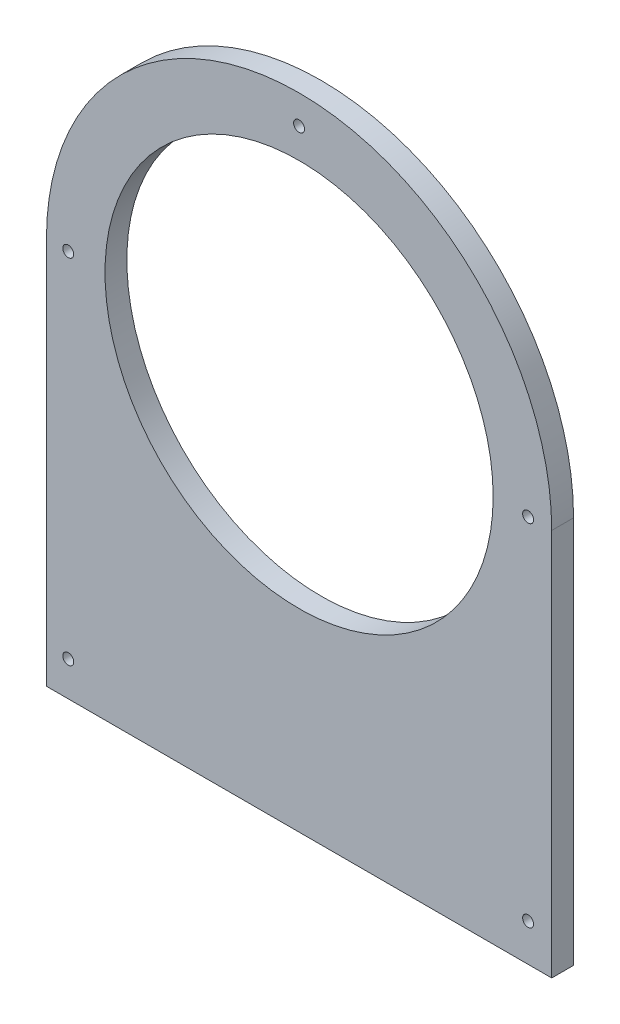
ISO-10303-21;
HEADER;
FILE_DESCRIPTION(('STEP AP214'),'2;1');
FILE_NAME('part.step','',(''),(''),'','','');
FILE_SCHEMA(('AUTOMOTIVE_DESIGN { 1 0 10303 214 1 1 1 1 }'));
ENDSEC;
DATA;
#1=APPLICATION_CONTEXT('core data for automotive mechanical design processes');
#2=APPLICATION_PROTOCOL_DEFINITION('international standard','automotive_design',2000,#1);
#3=PRODUCT_CONTEXT('',#1,'mechanical');
#4=PRODUCT('Part','Part','',(#3));
#5=PRODUCT_RELATED_PRODUCT_CATEGORY('part','',(#4));
#6=PRODUCT_DEFINITION_FORMATION('','',#4);
#7=PRODUCT_DEFINITION_CONTEXT('part definition',#1,'design');
#8=PRODUCT_DEFINITION('design','',#6,#7);
#9=PRODUCT_DEFINITION_SHAPE('','',#8);
#10=(LENGTH_UNIT() NAMED_UNIT(*) SI_UNIT(.MILLI.,.METRE.));
#11=(NAMED_UNIT(*) PLANE_ANGLE_UNIT() SI_UNIT($,.RADIAN.));
#12=(NAMED_UNIT(*) SI_UNIT($,.STERADIAN.) SOLID_ANGLE_UNIT());
#13=UNCERTAINTY_MEASURE_WITH_UNIT(LENGTH_MEASURE(1.E-05),#10,'distance_accuracy_value','');
#14=(GEOMETRIC_REPRESENTATION_CONTEXT(3) GLOBAL_UNCERTAINTY_ASSIGNED_CONTEXT((#13)) GLOBAL_UNIT_ASSIGNED_CONTEXT((#10,
#11,#12)) REPRESENTATION_CONTEXT('',''));
#15=CARTESIAN_POINT('',(0.,0.,0.));
#16=DIRECTION('',(0.,0.,1.));
#17=DIRECTION('',(1.,0.,0.));
#18=AXIS2_PLACEMENT_3D('',#15,#16,#17);
#19=CARTESIAN_POINT('',(0.,0.,4.));
#20=DIRECTION('',(0.,0.,1.));
#21=DIRECTION('',(1.,0.,0.));
#22=AXIS2_PLACEMENT_3D('',#19,#20,#21);
#23=PLANE('',#22);
#24=CARTESIAN_POINT('',(0.,20.5,4.));
#25=DIRECTION('',(0.,0.,1.));
#26=DIRECTION('',(1.,0.,0.));
#27=AXIS2_PLACEMENT_3D('',#24,#25,#26);
#28=CIRCLE('',#27,0.5);
#29=CARTESIAN_POINT('',(0.500000000000005,20.5,4.));
#30=VERTEX_POINT('',#29);
#31=EDGE_CURVE('E116',#30,#30,#28,.T.);
#32=ORIENTED_EDGE('',*,*,#31,.F.);
#33=EDGE_LOOP('',(#32));
#34=FACE_BOUND('',#33,.T.);
#35=CARTESIAN_POINT('',(-21.1408316826378,0.,4.));
#36=DIRECTION('',(0.,0.,1.));
#37=DIRECTION('',(1.,0.,0.));
#38=AXIS2_PLACEMENT_3D('',#35,#36,#37);
#39=CIRCLE('',#38,0.499999999999999);
#40=CARTESIAN_POINT('',(-20.6408316826378,0.,4.));
#41=VERTEX_POINT('',#40);
#42=EDGE_CURVE('E145',#41,#41,#39,.T.);
#43=ORIENTED_EDGE('',*,*,#42,.F.);
#44=EDGE_LOOP('',(#43));
#45=FACE_BOUND('',#44,.T.);
#46=CARTESIAN_POINT('',(20.9746954808096,0.,4.));
#47=DIRECTION('',(0.,0.,1.));
#48=DIRECTION('',(1.,0.,0.));
#49=AXIS2_PLACEMENT_3D('',#46,#47,#48);
#50=CIRCLE('',#49,0.499999999999999);
#51=CARTESIAN_POINT('',(21.4746954808096,0.,4.));
#52=VERTEX_POINT('',#51);
#53=EDGE_CURVE('E142',#52,#52,#50,.T.);
#54=ORIENTED_EDGE('',*,*,#53,.F.);
#55=EDGE_LOOP('',(#54));
#56=FACE_BOUND('',#55,.T.);
#57=CARTESIAN_POINT('',(-21.1408316826378,-32.3279733252439,4.));
#58=DIRECTION('',(0.,0.,1.));
#59=DIRECTION('',(1.,0.,0.));
#60=AXIS2_PLACEMENT_3D('',#57,#58,#59);
#61=CIRCLE('',#60,0.499999999999999);
#62=CARTESIAN_POINT('',(-20.6408316826378,-32.3279733252439,4.));
#63=VERTEX_POINT('',#62);
#64=EDGE_CURVE('E139',#63,#63,#61,.T.);
#65=ORIENTED_EDGE('',*,*,#64,.F.);
#66=EDGE_LOOP('',(#65));
#67=FACE_BOUND('',#66,.T.);
#68=CARTESIAN_POINT('',(20.9746954808096,-32.0642603339644,4.));
#69=DIRECTION('',(0.,0.,1.));
#70=DIRECTION('',(1.,0.,0.));
#71=AXIS2_PLACEMENT_3D('',#68,#69,#70);
#72=CIRCLE('',#71,0.499999999999999);
#73=CARTESIAN_POINT('',(21.4746954808096,-32.0642603339644,4.));
#74=VERTEX_POINT('',#73);
#75=EDGE_CURVE('E136',#74,#74,#72,.T.);
#76=ORIENTED_EDGE('',*,*,#75,.F.);
#77=EDGE_LOOP('',(#76));
#78=FACE_BOUND('',#77,.T.);
#79=DIRECTION('',(1.,0.,0.));
#80=VECTOR('',#79,1.);
#81=CARTESIAN_POINT('',(-23.1391726111028,-35.5,4.));
#82=LINE('',#81,#80);
#83=CARTESIAN_POINT('',(-23.1391726111028,-35.5,4.));
#84=VERTEX_POINT('',#83);
#85=CARTESIAN_POINT('',(23.1391726111028,-35.5,4.));
#86=VERTEX_POINT('',#85);
#87=EDGE_CURVE('E90',#84,#86,#82,.T.);
#88=ORIENTED_EDGE('',*,*,#87,.T.);
#89=DIRECTION('',(0.,1.,0.));
#90=VECTOR('',#89,1.);
#91=CARTESIAN_POINT('',(23.1391726111028,-35.5,4.));
#92=LINE('',#91,#90);
#93=CARTESIAN_POINT('',(23.1391726111028,3.593884949195E-11,4.));
#94=VERTEX_POINT('',#93);
#95=EDGE_CURVE('E85',#86,#94,#92,.T.);
#96=ORIENTED_EDGE('',*,*,#95,.T.);
#97=CARTESIAN_POINT('',(0.,0.,4.));
#98=DIRECTION('',(0.,0.,1.));
#99=DIRECTION('',(1.,0.,0.));
#100=AXIS2_PLACEMENT_3D('',#97,#98,#99);
#101=CIRCLE('',#100,23.1391726111028);
#102=CARTESIAN_POINT('',(-23.1391726111028,0.,4.));
#103=VERTEX_POINT('',#102);
#104=EDGE_CURVE('E88',#94,#103,#101,.T.);
#105=ORIENTED_EDGE('',*,*,#104,.T.);
#106=DIRECTION('',(0.,-1.,0.));
#107=VECTOR('',#106,1.);
#108=CARTESIAN_POINT('',(-23.1391726111028,0.,4.));
#109=LINE('',#108,#107);
#110=EDGE_CURVE('E55',#103,#84,#109,.T.);
#111=ORIENTED_EDGE('',*,*,#110,.T.);
#112=EDGE_LOOP('',(#88,#96,#105,#111));
#113=FACE_BOUND('',#112,.T.);
#114=CARTESIAN_POINT('',(0.,0.,4.));
#115=DIRECTION('',(0.,0.,1.));
#116=DIRECTION('',(1.,0.,0.));
#117=AXIS2_PLACEMENT_3D('',#114,#115,#116);
#118=CIRCLE('',#117,17.775);
#119=CARTESIAN_POINT('',(17.775,0.,4.));
#120=VERTEX_POINT('',#119);
#121=EDGE_CURVE('E106',#120,#120,#118,.T.);
#122=ORIENTED_EDGE('',*,*,#121,.F.);
#123=EDGE_LOOP('',(#122));
#124=FACE_BOUND('',#123,.T.);
#125=ADVANCED_FACE('F36',(#34,#45,#56,#67,#78,#113,#124),#23,.T.);
#126=CARTESIAN_POINT('',(0.,0.,2.));
#127=DIRECTION('',(0.,0.,1.));
#128=DIRECTION('',(1.,0.,0.));
#129=AXIS2_PLACEMENT_3D('',#126,#127,#128);
#130=PLANE('',#129);
#131=CARTESIAN_POINT('',(0.,20.5,2.));
#132=DIRECTION('',(0.,0.,1.));
#133=DIRECTION('',(1.,0.,0.));
#134=AXIS2_PLACEMENT_3D('',#131,#132,#133);
#135=CIRCLE('',#134,0.5);
#136=CARTESIAN_POINT('',(0.500000000000005,20.5,2.));
#137=VERTEX_POINT('',#136);
#138=EDGE_CURVE('E40',#137,#137,#135,.T.);
#139=ORIENTED_EDGE('',*,*,#138,.T.);
#140=EDGE_LOOP('',(#139));
#141=FACE_BOUND('',#140,.T.);
#142=CARTESIAN_POINT('',(-21.1408316826378,0.,2.));
#143=DIRECTION('',(0.,0.,1.));
#144=DIRECTION('',(1.,0.,0.));
#145=AXIS2_PLACEMENT_3D('',#142,#143,#144);
#146=CIRCLE('',#145,0.499999999999999);
#147=CARTESIAN_POINT('',(-20.6408316826378,0.,2.));
#148=VERTEX_POINT('',#147);
#149=EDGE_CURVE('E121',#148,#148,#146,.T.);
#150=ORIENTED_EDGE('',*,*,#149,.T.);
#151=EDGE_LOOP('',(#150));
#152=FACE_BOUND('',#151,.T.);
#153=CARTESIAN_POINT('',(20.9746954808096,0.,2.));
#154=DIRECTION('',(0.,0.,1.));
#155=DIRECTION('',(1.,0.,0.));
#156=AXIS2_PLACEMENT_3D('',#153,#154,#155);
#157=CIRCLE('',#156,0.499999999999999);
#158=CARTESIAN_POINT('',(21.4746954808096,0.,2.));
#159=VERTEX_POINT('',#158);
#160=EDGE_CURVE('E119',#159,#159,#157,.T.);
#161=ORIENTED_EDGE('',*,*,#160,.T.);
#162=EDGE_LOOP('',(#161));
#163=FACE_BOUND('',#162,.T.);
#164=CARTESIAN_POINT('',(-21.1408316826378,-32.3279733252439,2.));
#165=DIRECTION('',(0.,0.,1.));
#166=DIRECTION('',(1.,0.,0.));
#167=AXIS2_PLACEMENT_3D('',#164,#165,#166);
#168=CIRCLE('',#167,0.499999999999999);
#169=CARTESIAN_POINT('',(-20.6408316826378,-32.3279733252439,2.));
#170=VERTEX_POINT('',#169);
#171=EDGE_CURVE('E115',#170,#170,#168,.T.);
#172=ORIENTED_EDGE('',*,*,#171,.T.);
#173=EDGE_LOOP('',(#172));
#174=FACE_BOUND('',#173,.T.);
#175=CARTESIAN_POINT('',(20.9746954808096,-32.0642603339644,2.));
#176=DIRECTION('',(0.,0.,1.));
#177=DIRECTION('',(1.,0.,0.));
#178=AXIS2_PLACEMENT_3D('',#175,#176,#177);
#179=CIRCLE('',#178,0.499999999999999);
#180=CARTESIAN_POINT('',(21.4746954808096,-32.0642603339644,2.));
#181=VERTEX_POINT('',#180);
#182=EDGE_CURVE('E112',#181,#181,#179,.T.);
#183=ORIENTED_EDGE('',*,*,#182,.T.);
#184=EDGE_LOOP('',(#183));
#185=FACE_BOUND('',#184,.T.);
#186=DIRECTION('',(1.,0.,0.));
#187=VECTOR('',#186,1.);
#188=CARTESIAN_POINT('',(-23.1391726111028,-35.5,2.));
#189=LINE('',#188,#187);
#190=CARTESIAN_POINT('',(-23.1391726111028,-35.5,2.));
#191=VERTEX_POINT('',#190);
#192=CARTESIAN_POINT('',(23.1391726111028,-35.5,2.));
#193=VERTEX_POINT('',#192);
#194=EDGE_CURVE('E103',#191,#193,#189,.T.);
#195=ORIENTED_EDGE('',*,*,#194,.F.);
#196=DIRECTION('',(0.,-1.,0.));
#197=VECTOR('',#196,1.);
#198=CARTESIAN_POINT('',(-23.1391726111028,0.,2.));
#199=LINE('',#198,#197);
#200=CARTESIAN_POINT('',(-23.1391726111028,0.,2.));
#201=VERTEX_POINT('',#200);
#202=EDGE_CURVE('E78',#201,#191,#199,.T.);
#203=ORIENTED_EDGE('',*,*,#202,.F.);
#204=CARTESIAN_POINT('',(0.,0.,2.));
#205=DIRECTION('',(0.,0.,1.));
#206=DIRECTION('',(1.,0.,0.));
#207=AXIS2_PLACEMENT_3D('',#204,#205,#206);
#208=CIRCLE('',#207,23.1391726111028);
#209=CARTESIAN_POINT('',(23.1391726111028,3.593884949195E-11,2.));
#210=VERTEX_POINT('',#209);
#211=EDGE_CURVE('E72',#210,#201,#208,.T.);
#212=ORIENTED_EDGE('',*,*,#211,.F.);
#213=DIRECTION('',(0.,1.,0.));
#214=VECTOR('',#213,1.);
#215=CARTESIAN_POINT('',(23.1391726111028,-35.5,2.));
#216=LINE('',#215,#214);
#217=EDGE_CURVE('E94',#193,#210,#216,.T.);
#218=ORIENTED_EDGE('',*,*,#217,.F.);
#219=EDGE_LOOP('',(#195,#203,#212,#218));
#220=FACE_BOUND('',#219,.T.);
#221=CARTESIAN_POINT('',(0.,0.,2.));
#222=DIRECTION('',(0.,0.,1.));
#223=DIRECTION('',(1.,0.,0.));
#224=AXIS2_PLACEMENT_3D('',#221,#222,#223);
#225=CIRCLE('',#224,17.775);
#226=CARTESIAN_POINT('',(17.775,0.,2.));
#227=VERTEX_POINT('',#226);
#228=EDGE_CURVE('E126',#227,#227,#225,.T.);
#229=ORIENTED_EDGE('',*,*,#228,.T.);
#230=EDGE_LOOP('',(#229));
#231=FACE_BOUND('',#230,.T.);
#232=ADVANCED_FACE('F156',(#141,#152,#163,#174,#185,#220,#231),#130,.F.);
#233=CARTESIAN_POINT('',(-23.1391726111028,-35.5,4.));
#234=DIRECTION('',(0.,1.,0.));
#235=DIRECTION('',(0.,0.,1.));
#236=AXIS2_PLACEMENT_3D('',#233,#234,#235);
#237=PLANE('',#236);
#238=ORIENTED_EDGE('',*,*,#194,.T.);
#239=DIRECTION('',(0.,0.,-1.));
#240=VECTOR('',#239,1.);
#241=CARTESIAN_POINT('',(23.1391726111028,-35.5,4.));
#242=LINE('',#241,#240);
#243=EDGE_CURVE('E11',#86,#193,#242,.T.);
#244=ORIENTED_EDGE('',*,*,#243,.F.);
#245=ORIENTED_EDGE('',*,*,#87,.F.);
#246=DIRECTION('',(0.,0.,-1.));
#247=VECTOR('',#246,1.);
#248=CARTESIAN_POINT('',(-23.1391726111028,-35.5,4.));
#249=LINE('',#248,#247);
#250=EDGE_CURVE('E99',#84,#191,#249,.T.);
#251=ORIENTED_EDGE('',*,*,#250,.T.);
#252=EDGE_LOOP('',(#238,#244,#245,#251));
#253=FACE_BOUND('',#252,.T.);
#254=ADVANCED_FACE('F38',(#253),#237,.F.);
#255=CARTESIAN_POINT('',(23.1391726111028,-35.5,4.));
#256=DIRECTION('',(-1.,0.,0.));
#257=DIRECTION('',(0.,-1.,0.));
#258=AXIS2_PLACEMENT_3D('',#255,#256,#257);
#259=PLANE('',#258);
#260=ORIENTED_EDGE('',*,*,#217,.T.);
#261=DIRECTION('',(0.,0.,-1.));
#262=VECTOR('',#261,1.);
#263=CARTESIAN_POINT('',(23.1391726111028,3.593884949195E-11,4.));
#264=LINE('',#263,#262);
#265=EDGE_CURVE('E46',#94,#210,#264,.T.);
#266=ORIENTED_EDGE('',*,*,#265,.F.);
#267=ORIENTED_EDGE('',*,*,#95,.F.);
#268=ORIENTED_EDGE('',*,*,#243,.T.);
#269=EDGE_LOOP('',(#260,#266,#267,#268));
#270=FACE_BOUND('',#269,.T.);
#271=ADVANCED_FACE('F93',(#270),#259,.F.);
#272=CARTESIAN_POINT('',(0.,0.,4.));
#273=DIRECTION('',(0.,0.,-1.));
#274=DIRECTION('',(-1.,0.,0.));
#275=AXIS2_PLACEMENT_3D('',#272,#273,#274);
#276=CYLINDRICAL_SURFACE('',#275,23.1391726111028);
#277=ORIENTED_EDGE('',*,*,#211,.T.);
#278=DIRECTION('',(0.,0.,-1.));
#279=VECTOR('',#278,1.);
#280=CARTESIAN_POINT('',(-23.1391726111028,0.,4.));
#281=LINE('',#280,#279);
#282=EDGE_CURVE('E95',#103,#201,#281,.T.);
#283=ORIENTED_EDGE('',*,*,#282,.F.);
#284=ORIENTED_EDGE('',*,*,#104,.F.);
#285=ORIENTED_EDGE('',*,*,#265,.T.);
#286=EDGE_LOOP('',(#277,#283,#284,#285));
#287=FACE_BOUND('',#286,.T.);
#288=ADVANCED_FACE('F97',(#287),#276,.T.);
#289=CARTESIAN_POINT('',(-23.1391726111028,0.,4.));
#290=DIRECTION('',(1.,0.,0.));
#291=DIRECTION('',(0.,1.,0.));
#292=AXIS2_PLACEMENT_3D('',#289,#290,#291);
#293=PLANE('',#292);
#294=ORIENTED_EDGE('',*,*,#202,.T.);
#295=ORIENTED_EDGE('',*,*,#250,.F.);
#296=ORIENTED_EDGE('',*,*,#110,.F.);
#297=ORIENTED_EDGE('',*,*,#282,.T.);
#298=EDGE_LOOP('',(#294,#295,#296,#297));
#299=FACE_BOUND('',#298,.T.);
#300=ADVANCED_FACE('F179',(#299),#293,.F.);
#301=CARTESIAN_POINT('',(0.,0.,4.));
#302=DIRECTION('',(0.,0.,-1.));
#303=DIRECTION('',(-1.,0.,0.));
#304=AXIS2_PLACEMENT_3D('',#301,#302,#303);
#305=CYLINDRICAL_SURFACE('',#304,17.775);
#306=ORIENTED_EDGE('',*,*,#121,.T.);
#307=EDGE_LOOP('',(#306));
#308=FACE_BOUND('',#307,.T.);
#309=ORIENTED_EDGE('',*,*,#228,.F.);
#310=EDGE_LOOP('',(#309));
#311=FACE_BOUND('',#310,.T.);
#312=ADVANCED_FACE('F170',(#308,#311),#305,.F.);
#313=CARTESIAN_POINT('',(20.9746954808096,-32.0642603339644,-8.));
#314=DIRECTION('',(0.,0.,1.));
#315=DIRECTION('',(1.,0.,0.));
#316=AXIS2_PLACEMENT_3D('',#313,#314,#315);
#317=CYLINDRICAL_SURFACE('',#316,0.499999999999999);
#318=ORIENTED_EDGE('',*,*,#75,.T.);
#319=EDGE_LOOP('',(#318));
#320=FACE_BOUND('',#319,.T.);
#321=ORIENTED_EDGE('',*,*,#182,.F.);
#322=EDGE_LOOP('',(#321));
#323=FACE_BOUND('',#322,.T.);
#324=ADVANCED_FACE('F166',(#320,#323),#317,.F.);
#325=CARTESIAN_POINT('',(-21.1408316826378,-32.3279733252439,-8.));
#326=DIRECTION('',(0.,0.,1.));
#327=DIRECTION('',(1.,0.,0.));
#328=AXIS2_PLACEMENT_3D('',#325,#326,#327);
#329=CYLINDRICAL_SURFACE('',#328,0.499999999999999);
#330=ORIENTED_EDGE('',*,*,#64,.T.);
#331=EDGE_LOOP('',(#330));
#332=FACE_BOUND('',#331,.T.);
#333=ORIENTED_EDGE('',*,*,#171,.F.);
#334=EDGE_LOOP('',(#333));
#335=FACE_BOUND('',#334,.T.);
#336=ADVANCED_FACE('F169',(#332,#335),#329,.F.);
#337=CARTESIAN_POINT('',(20.9746954808096,0.,-8.));
#338=DIRECTION('',(0.,0.,1.));
#339=DIRECTION('',(1.,0.,0.));
#340=AXIS2_PLACEMENT_3D('',#337,#338,#339);
#341=CYLINDRICAL_SURFACE('',#340,0.499999999999999);
#342=ORIENTED_EDGE('',*,*,#53,.T.);
#343=EDGE_LOOP('',(#342));
#344=FACE_BOUND('',#343,.T.);
#345=ORIENTED_EDGE('',*,*,#160,.F.);
#346=EDGE_LOOP('',(#345));
#347=FACE_BOUND('',#346,.T.);
#348=ADVANCED_FACE('F256',(#344,#347),#341,.F.);
#349=CARTESIAN_POINT('',(-21.1408316826378,0.,-8.));
#350=DIRECTION('',(0.,0.,1.));
#351=DIRECTION('',(1.,0.,0.));
#352=AXIS2_PLACEMENT_3D('',#349,#350,#351);
#353=CYLINDRICAL_SURFACE('',#352,0.499999999999999);
#354=ORIENTED_EDGE('',*,*,#42,.T.);
#355=EDGE_LOOP('',(#354));
#356=FACE_BOUND('',#355,.T.);
#357=ORIENTED_EDGE('',*,*,#149,.F.);
#358=EDGE_LOOP('',(#357));
#359=FACE_BOUND('',#358,.T.);
#360=ADVANCED_FACE('F267',(#356,#359),#353,.F.);
#361=CARTESIAN_POINT('',(0.,20.5,-8.));
#362=DIRECTION('',(0.,0.,1.));
#363=DIRECTION('',(1.,0.,0.));
#364=AXIS2_PLACEMENT_3D('',#361,#362,#363);
#365=CYLINDRICAL_SURFACE('',#364,0.5);
#366=ORIENTED_EDGE('',*,*,#31,.T.);
#367=EDGE_LOOP('',(#366));
#368=FACE_BOUND('',#367,.T.);
#369=ORIENTED_EDGE('',*,*,#138,.F.);
#370=EDGE_LOOP('',(#369));
#371=FACE_BOUND('',#370,.T.);
#372=ADVANCED_FACE('F151',(#368,#371),#365,.F.);
#373=CLOSED_SHELL('',(#125,#232,#254,#271,#288,#300,#312,#324,#336,#348,#360,#372));
#374=MANIFOLD_SOLID_BREP('B2',#373);
#375=ADVANCED_BREP_SHAPE_REPRESENTATION('',(#18,#374),#14);
#376=SHAPE_DEFINITION_REPRESENTATION(#9,#375);
ENDSEC;
END-ISO-10303-21;
